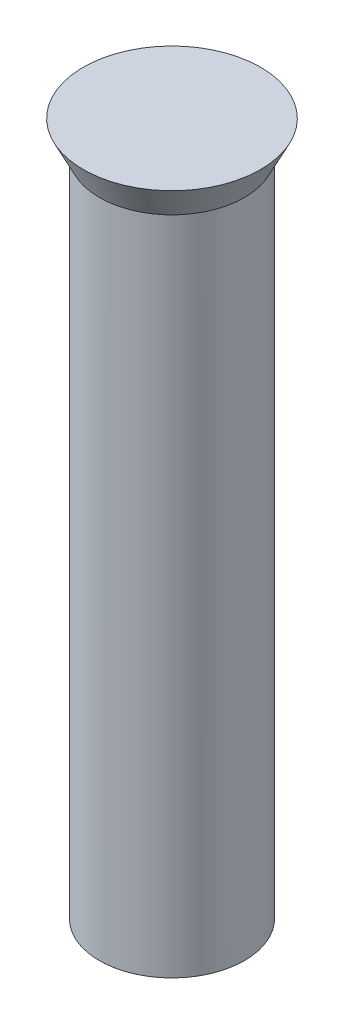
ISO-10303-21;
HEADER;
FILE_DESCRIPTION(('STEP AP214'),'2;1');
FILE_NAME('part.step','',(''),(''),'','','');
FILE_SCHEMA(('AUTOMOTIVE_DESIGN { 1 0 10303 214 1 1 1 1 }'));
ENDSEC;
DATA;
#1=APPLICATION_CONTEXT('core data for automotive mechanical design processes');
#2=APPLICATION_PROTOCOL_DEFINITION('international standard','automotive_design',2000,#1);
#3=PRODUCT_CONTEXT('',#1,'mechanical');
#4=PRODUCT('Part','Part','',(#3));
#5=PRODUCT_RELATED_PRODUCT_CATEGORY('part','',(#4));
#6=PRODUCT_DEFINITION_FORMATION('','',#4);
#7=PRODUCT_DEFINITION_CONTEXT('part definition',#1,'design');
#8=PRODUCT_DEFINITION('design','',#6,#7);
#9=PRODUCT_DEFINITION_SHAPE('','',#8);
#10=(LENGTH_UNIT() NAMED_UNIT(*) SI_UNIT(.MILLI.,.METRE.));
#11=(NAMED_UNIT(*) PLANE_ANGLE_UNIT() SI_UNIT($,.RADIAN.));
#12=(NAMED_UNIT(*) SI_UNIT($,.STERADIAN.) SOLID_ANGLE_UNIT());
#13=UNCERTAINTY_MEASURE_WITH_UNIT(LENGTH_MEASURE(1.E-05),#10,'distance_accuracy_value','');
#14=(GEOMETRIC_REPRESENTATION_CONTEXT(3) GLOBAL_UNCERTAINTY_ASSIGNED_CONTEXT((#13)) GLOBAL_UNIT_ASSIGNED_CONTEXT((#10,
#11,#12)) REPRESENTATION_CONTEXT('',''));
#15=CARTESIAN_POINT('',(0.,0.,0.));
#16=DIRECTION('',(0.,0.,1.));
#17=DIRECTION('',(1.,0.,0.));
#18=AXIS2_PLACEMENT_3D('',#15,#16,#17);
#19=CARTESIAN_POINT('',(0.,80.,0.));
#20=DIRECTION('',(0.,-1.,0.));
#21=DIRECTION('',(0.,0.,-1.));
#22=AXIS2_PLACEMENT_3D('',#19,#20,#21);
#23=CYLINDRICAL_SURFACE('',#22,9.);
#24=CARTESIAN_POINT('',(0.,80.,0.));
#25=DIRECTION('',(0.,1.,0.));
#26=DIRECTION('',(0.,0.,1.));
#27=AXIS2_PLACEMENT_3D('',#24,#25,#26);
#28=CIRCLE('',#27,9.);
#29=CARTESIAN_POINT('',(0.,80.,9.));
#30=VERTEX_POINT('',#29);
#31=EDGE_CURVE('E10',#30,#30,#28,.T.);
#32=ORIENTED_EDGE('',*,*,#31,.F.);
#33=EDGE_LOOP('',(#32));
#34=FACE_BOUND('',#33,.T.);
#35=CARTESIAN_POINT('',(0.,-2.,0.));
#36=DIRECTION('',(0.,-1.,0.));
#37=DIRECTION('',(0.,0.,-1.));
#38=AXIS2_PLACEMENT_3D('',#35,#36,#37);
#39=CIRCLE('',#38,9.);
#40=CARTESIAN_POINT('',(0.,-2.,-9.));
#41=VERTEX_POINT('',#40);
#42=EDGE_CURVE('E37',#41,#41,#39,.T.);
#43=ORIENTED_EDGE('',*,*,#42,.F.);
#44=EDGE_LOOP('',(#43));
#45=FACE_BOUND('',#44,.T.);
#46=ADVANCED_FACE('F31',(#34,#45),#23,.T.);
#47=CARTESIAN_POINT('',(0.,-2.,0.));
#48=DIRECTION('',(0.,-1.,0.));
#49=DIRECTION('',(0.,0.,-1.));
#50=AXIS2_PLACEMENT_3D('',#47,#48,#49);
#51=PLANE('',#50);
#52=ORIENTED_EDGE('',*,*,#42,.T.);
#53=EDGE_LOOP('',(#52));
#54=FACE_BOUND('',#53,.T.);
#55=ADVANCED_FACE('F56',(#54),#51,.T.);
#56=CARTESIAN_POINT('',(0.,80.,0.));
#57=DIRECTION('',(0.,1.,0.));
#58=DIRECTION('',(0.,0.,1.));
#59=AXIS2_PLACEMENT_3D('',#56,#57,#58);
#60=CONICAL_SURFACE('',#59,9.,0.46285956522698);
#61=CARTESIAN_POINT('',(0.,84.0078928792408,0.));
#62=DIRECTION('',(0.,-1.,0.));
#63=DIRECTION('',(0.,0.,-1.));
#64=AXIS2_PLACEMENT_3D('',#61,#62,#63);
#65=CIRCLE('',#64,11.);
#66=CARTESIAN_POINT('',(0.,84.0078928792408,-11.));
#67=VERTEX_POINT('',#66);
#68=EDGE_CURVE('E41',#67,#67,#65,.T.);
#69=ORIENTED_EDGE('',*,*,#68,.T.);
#70=EDGE_LOOP('',(#69));
#71=FACE_BOUND('',#70,.T.);
#72=ORIENTED_EDGE('',*,*,#31,.T.);
#73=EDGE_LOOP('',(#72));
#74=FACE_BOUND('',#73,.T.);
#75=ADVANCED_FACE('F48',(#71,#74),#60,.T.);
#76=CARTESIAN_POINT('',(0.,84.0078928792408,-11.));
#77=DIRECTION('',(0.,1.,0.));
#78=DIRECTION('',(0.,0.,1.));
#79=AXIS2_PLACEMENT_3D('',#76,#77,#78);
#80=PLANE('',#79);
#81=ORIENTED_EDGE('',*,*,#68,.F.);
#82=EDGE_LOOP('',(#81));
#83=FACE_BOUND('',#82,.T.);
#84=ADVANCED_FACE('F50',(#83),#80,.T.);
#85=CLOSED_SHELL('',(#46,#55,#75,#84));
#86=MANIFOLD_SOLID_BREP('B2',#85);
#87=ADVANCED_BREP_SHAPE_REPRESENTATION('',(#18,#86),#14);
#88=SHAPE_DEFINITION_REPRESENTATION(#9,#87);
ENDSEC;
END-ISO-10303-21;
